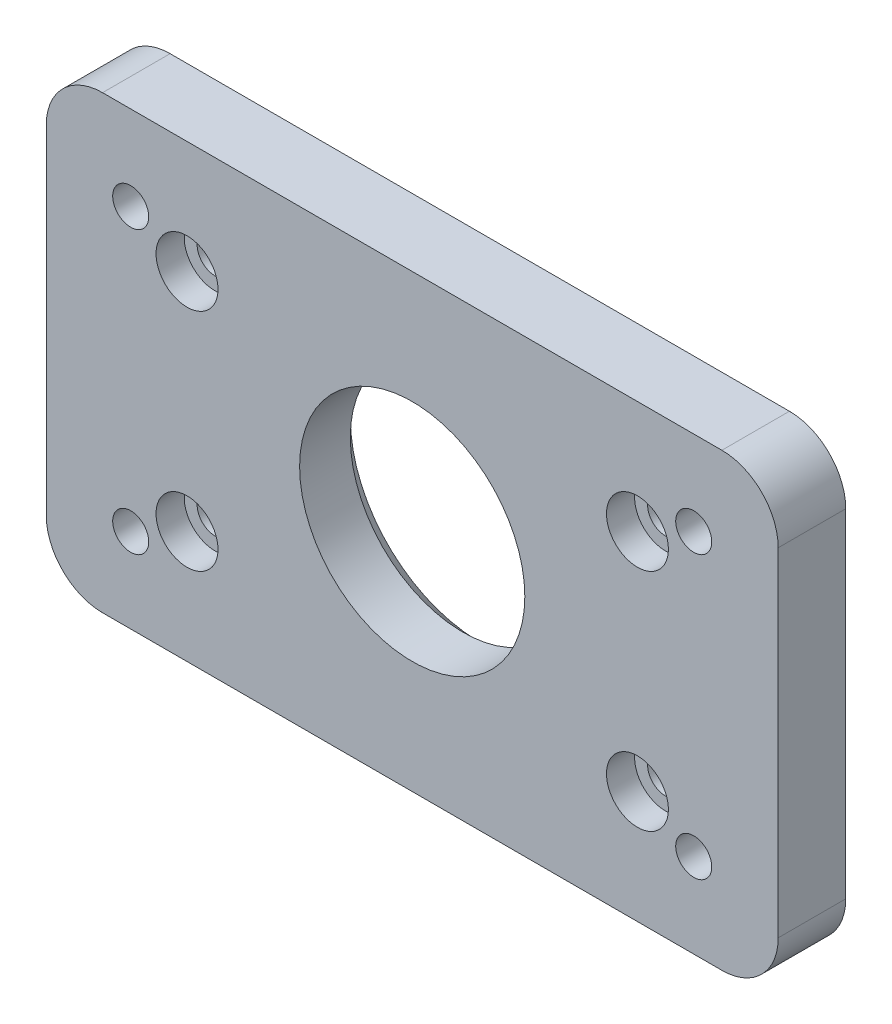
ISO-10303-21;
HEADER;
FILE_DESCRIPTION(('STEP AP214'),'2;1');
FILE_NAME('part.step','',(''),(''),'','','');
FILE_SCHEMA(('AUTOMOTIVE_DESIGN { 1 0 10303 214 1 1 1 1 }'));
ENDSEC;
DATA;
#1=APPLICATION_CONTEXT('core data for automotive mechanical design processes');
#2=APPLICATION_PROTOCOL_DEFINITION('international standard','automotive_design',2000,#1);
#3=PRODUCT_CONTEXT('',#1,'mechanical');
#4=PRODUCT('Part','Part','',(#3));
#5=PRODUCT_RELATED_PRODUCT_CATEGORY('part','',(#4));
#6=PRODUCT_DEFINITION_FORMATION('','',#4);
#7=PRODUCT_DEFINITION_CONTEXT('part definition',#1,'design');
#8=PRODUCT_DEFINITION('design','',#6,#7);
#9=PRODUCT_DEFINITION_SHAPE('','',#8);
#10=(LENGTH_UNIT() NAMED_UNIT(*) SI_UNIT(.MILLI.,.METRE.));
#11=(NAMED_UNIT(*) PLANE_ANGLE_UNIT() SI_UNIT($,.RADIAN.));
#12=(NAMED_UNIT(*) SI_UNIT($,.STERADIAN.) SOLID_ANGLE_UNIT());
#13=UNCERTAINTY_MEASURE_WITH_UNIT(LENGTH_MEASURE(1.E-05),#10,'distance_accuracy_value','');
#14=(GEOMETRIC_REPRESENTATION_CONTEXT(3) GLOBAL_UNCERTAINTY_ASSIGNED_CONTEXT((#13)) GLOBAL_UNIT_ASSIGNED_CONTEXT((#10,
#11,#12)) REPRESENTATION_CONTEXT('',''));
#15=CARTESIAN_POINT('',(0.,0.,0.));
#16=DIRECTION('',(0.,0.,1.));
#17=DIRECTION('',(1.,0.,0.));
#18=AXIS2_PLACEMENT_3D('',#15,#16,#17);
#19=CARTESIAN_POINT('',(40.,-20.,12.));
#20=DIRECTION('',(0.,0.,-1.));
#21=DIRECTION('',(-1.,0.,0.));
#22=AXIS2_PLACEMENT_3D('',#19,#20,#21);
#23=CYLINDRICAL_SURFACE('',#22,3.2);
#24=CARTESIAN_POINT('',(40.,-20.,0.));
#25=DIRECTION('',(0.,0.,1.));
#26=DIRECTION('',(1.,0.,0.));
#27=AXIS2_PLACEMENT_3D('',#24,#25,#26);
#28=CIRCLE('',#27,3.2);
#29=CARTESIAN_POINT('',(43.2,-20.,0.));
#30=VERTEX_POINT('',#29);
#31=EDGE_CURVE('E215',#30,#30,#28,.T.);
#32=ORIENTED_EDGE('',*,*,#31,.F.);
#33=EDGE_LOOP('',(#32));
#34=FACE_BOUND('',#33,.T.);
#35=CARTESIAN_POINT('',(40.,-20.,7.));
#36=DIRECTION('',(0.,0.,1.));
#37=DIRECTION('',(1.,0.,0.));
#38=AXIS2_PLACEMENT_3D('',#35,#36,#37);
#39=CIRCLE('',#38,3.2);
#40=CARTESIAN_POINT('',(43.2,-20.,7.));
#41=VERTEX_POINT('',#40);
#42=EDGE_CURVE('E51',#41,#41,#39,.T.);
#43=ORIENTED_EDGE('',*,*,#42,.T.);
#44=EDGE_LOOP('',(#43));
#45=FACE_BOUND('',#44,.T.);
#46=ADVANCED_FACE('F46',(#34,#45),#23,.F.);
#47=CARTESIAN_POINT('',(-40.,20.,12.));
#48=DIRECTION('',(0.,0.,-1.));
#49=DIRECTION('',(-1.,0.,0.));
#50=AXIS2_PLACEMENT_3D('',#47,#48,#49);
#51=CYLINDRICAL_SURFACE('',#50,3.2);
#52=CARTESIAN_POINT('',(-40.,20.,0.));
#53=DIRECTION('',(0.,0.,1.));
#54=DIRECTION('',(1.,0.,0.));
#55=AXIS2_PLACEMENT_3D('',#52,#53,#54);
#56=CIRCLE('',#55,3.2);
#57=CARTESIAN_POINT('',(-36.8,20.,0.));
#58=VERTEX_POINT('',#57);
#59=EDGE_CURVE('E190',#58,#58,#56,.T.);
#60=ORIENTED_EDGE('',*,*,#59,.F.);
#61=EDGE_LOOP('',(#60));
#62=FACE_BOUND('',#61,.T.);
#63=CARTESIAN_POINT('',(-40.,20.,7.));
#64=DIRECTION('',(0.,0.,1.));
#65=DIRECTION('',(1.,0.,0.));
#66=AXIS2_PLACEMENT_3D('',#63,#64,#65);
#67=CIRCLE('',#66,3.2);
#68=CARTESIAN_POINT('',(-36.8,20.,7.));
#69=VERTEX_POINT('',#68);
#70=EDGE_CURVE('E181',#69,#69,#67,.T.);
#71=ORIENTED_EDGE('',*,*,#70,.T.);
#72=EDGE_LOOP('',(#71));
#73=FACE_BOUND('',#72,.T.);
#74=ADVANCED_FACE('F283',(#62,#73),#51,.F.);
#75=CARTESIAN_POINT('',(-40.,-20.,12.));
#76=DIRECTION('',(0.,0.,-1.));
#77=DIRECTION('',(-1.,0.,0.));
#78=AXIS2_PLACEMENT_3D('',#75,#76,#77);
#79=CYLINDRICAL_SURFACE('',#78,3.2);
#80=CARTESIAN_POINT('',(-40.,-20.,0.));
#81=DIRECTION('',(0.,0.,1.));
#82=DIRECTION('',(1.,0.,0.));
#83=AXIS2_PLACEMENT_3D('',#80,#81,#82);
#84=CIRCLE('',#83,3.2);
#85=CARTESIAN_POINT('',(-36.8,-20.,0.));
#86=VERTEX_POINT('',#85);
#87=EDGE_CURVE('E186',#86,#86,#84,.F.);
#88=ORIENTED_EDGE('',*,*,#87,.T.);
#89=EDGE_LOOP('',(#88));
#90=FACE_BOUND('',#89,.T.);
#91=CARTESIAN_POINT('',(-40.,-20.,7.));
#92=DIRECTION('',(0.,0.,1.));
#93=DIRECTION('',(1.,0.,0.));
#94=AXIS2_PLACEMENT_3D('',#91,#92,#93);
#95=CIRCLE('',#94,3.2);
#96=CARTESIAN_POINT('',(-36.8,-20.,7.));
#97=VERTEX_POINT('',#96);
#98=EDGE_CURVE('E178',#97,#97,#95,.F.);
#99=ORIENTED_EDGE('',*,*,#98,.F.);
#100=EDGE_LOOP('',(#99));
#101=FACE_BOUND('',#100,.T.);
#102=ADVANCED_FACE('F290',(#90,#101),#79,.F.);
#103=CARTESIAN_POINT('',(40.,20.,12.));
#104=DIRECTION('',(0.,0.,-1.));
#105=DIRECTION('',(-1.,0.,0.));
#106=AXIS2_PLACEMENT_3D('',#103,#104,#105);
#107=CYLINDRICAL_SURFACE('',#106,3.2);
#108=CARTESIAN_POINT('',(40.,20.,0.));
#109=DIRECTION('',(0.,0.,1.));
#110=DIRECTION('',(1.,0.,0.));
#111=AXIS2_PLACEMENT_3D('',#108,#109,#110);
#112=CIRCLE('',#111,3.2);
#113=CARTESIAN_POINT('',(43.2,20.,0.));
#114=VERTEX_POINT('',#113);
#115=EDGE_CURVE('E146',#114,#114,#112,.F.);
#116=ORIENTED_EDGE('',*,*,#115,.T.);
#117=EDGE_LOOP('',(#116));
#118=FACE_BOUND('',#117,.T.);
#119=CARTESIAN_POINT('',(40.,20.,7.));
#120=DIRECTION('',(0.,0.,1.));
#121=DIRECTION('',(1.,0.,0.));
#122=AXIS2_PLACEMENT_3D('',#119,#120,#121);
#123=CIRCLE('',#122,3.2);
#124=CARTESIAN_POINT('',(43.2,20.,7.));
#125=VERTEX_POINT('',#124);
#126=EDGE_CURVE('E175',#125,#125,#123,.F.);
#127=ORIENTED_EDGE('',*,*,#126,.F.);
#128=EDGE_LOOP('',(#127));
#129=FACE_BOUND('',#128,.T.);
#130=ADVANCED_FACE('F295',(#118,#129),#107,.F.);
#131=CARTESIAN_POINT('',(0.,-39.9999999999998,12.));
#132=DIRECTION('',(0.,-1.,0.));
#133=DIRECTION('',(0.,0.,-1.));
#134=AXIS2_PLACEMENT_3D('',#131,#132,#133);
#135=PLANE('',#134);
#136=DIRECTION('',(-1.,0.,0.));
#137=VECTOR('',#136,1.);
#138=CARTESIAN_POINT('',(0.,-39.9999999999998,0.));
#139=LINE('',#138,#137);
#140=CARTESIAN_POINT('',(55.,-39.9999999999998,0.));
#141=VERTEX_POINT('',#140);
#142=CARTESIAN_POINT('',(-55.,-39.9999999999998,0.));
#143=VERTEX_POINT('',#142);
#144=EDGE_CURVE('E207',#141,#143,#139,.T.);
#145=ORIENTED_EDGE('',*,*,#144,.F.);
#146=DIRECTION('',(0.,0.,-1.));
#147=VECTOR('',#146,1.);
#148=CARTESIAN_POINT('',(55.,-39.9999999999998,12.));
#149=LINE('',#148,#147);
#150=CARTESIAN_POINT('',(55.,-39.9999999999998,12.));
#151=VERTEX_POINT('',#150);
#152=EDGE_CURVE('E168',#141,#151,#149,.F.);
#153=ORIENTED_EDGE('',*,*,#152,.T.);
#154=DIRECTION('',(-1.,0.,0.));
#155=VECTOR('',#154,1.);
#156=CARTESIAN_POINT('',(0.,-39.9999999999998,12.));
#157=LINE('',#156,#155);
#158=CARTESIAN_POINT('',(-55.,-39.9999999999998,12.));
#159=VERTEX_POINT('',#158);
#160=EDGE_CURVE('E240',#151,#159,#157,.T.);
#161=ORIENTED_EDGE('',*,*,#160,.T.);
#162=DIRECTION('',(0.,0.,-1.));
#163=VECTOR('',#162,1.);
#164=CARTESIAN_POINT('',(-55.,-39.9999999999998,12.));
#165=LINE('',#164,#163);
#166=EDGE_CURVE('E165',#159,#143,#165,.T.);
#167=ORIENTED_EDGE('',*,*,#166,.T.);
#168=EDGE_LOOP('',(#145,#153,#161,#167));
#169=FACE_BOUND('',#168,.T.);
#170=ADVANCED_FACE('F258',(#169),#135,.T.);
#171=CARTESIAN_POINT('',(65.,0.,12.));
#172=DIRECTION('',(1.,0.,0.));
#173=DIRECTION('',(0.,0.,-1.));
#174=AXIS2_PLACEMENT_3D('',#171,#172,#173);
#175=PLANE('',#174);
#176=DIRECTION('',(0.,-1.,0.));
#177=VECTOR('',#176,1.);
#178=CARTESIAN_POINT('',(65.,0.,0.));
#179=LINE('',#178,#177);
#180=CARTESIAN_POINT('',(65.,30.,0.));
#181=VERTEX_POINT('',#180);
#182=CARTESIAN_POINT('',(65.,-29.9999999999997,0.));
#183=VERTEX_POINT('',#182);
#184=EDGE_CURVE('E136',#181,#183,#179,.T.);
#185=ORIENTED_EDGE('',*,*,#184,.F.);
#186=DIRECTION('',(0.,0.,-1.));
#187=VECTOR('',#186,1.);
#188=CARTESIAN_POINT('',(65.,30.,12.));
#189=LINE('',#188,#187);
#190=CARTESIAN_POINT('',(65.,30.,12.));
#191=VERTEX_POINT('',#190);
#192=EDGE_CURVE('E156',#181,#191,#189,.F.);
#193=ORIENTED_EDGE('',*,*,#192,.T.);
#194=DIRECTION('',(0.,-1.,0.));
#195=VECTOR('',#194,1.);
#196=CARTESIAN_POINT('',(65.,0.,12.));
#197=LINE('',#196,#195);
#198=CARTESIAN_POINT('',(65.,-29.9999999999997,12.));
#199=VERTEX_POINT('',#198);
#200=EDGE_CURVE('E243',#191,#199,#197,.T.);
#201=ORIENTED_EDGE('',*,*,#200,.T.);
#202=DIRECTION('',(0.,0.,-1.));
#203=VECTOR('',#202,1.);
#204=CARTESIAN_POINT('',(65.,-29.9999999999997,12.));
#205=LINE('',#204,#203);
#206=EDGE_CURVE('E153',#199,#183,#205,.T.);
#207=ORIENTED_EDGE('',*,*,#206,.T.);
#208=EDGE_LOOP('',(#185,#193,#201,#207));
#209=FACE_BOUND('',#208,.T.);
#210=ADVANCED_FACE('F266',(#209),#175,.T.);
#211=CARTESIAN_POINT('',(0.,40.,12.));
#212=DIRECTION('',(0.,1.,0.));
#213=DIRECTION('',(0.,0.,1.));
#214=AXIS2_PLACEMENT_3D('',#211,#212,#213);
#215=PLANE('',#214);
#216=DIRECTION('',(1.,0.,0.));
#217=VECTOR('',#216,1.);
#218=CARTESIAN_POINT('',(0.,40.,12.));
#219=LINE('',#218,#217);
#220=CARTESIAN_POINT('',(-55.,40.,12.));
#221=VERTEX_POINT('',#220);
#222=CARTESIAN_POINT('',(55.,40.,12.));
#223=VERTEX_POINT('',#222);
#224=EDGE_CURVE('E246',#221,#223,#219,.T.);
#225=ORIENTED_EDGE('',*,*,#224,.T.);
#226=DIRECTION('',(0.,0.,-1.));
#227=VECTOR('',#226,1.);
#228=CARTESIAN_POINT('',(55.,40.,12.));
#229=LINE('',#228,#227);
#230=CARTESIAN_POINT('',(55.,40.,0.));
#231=VERTEX_POINT('',#230);
#232=EDGE_CURVE('E135',#223,#231,#229,.T.);
#233=ORIENTED_EDGE('',*,*,#232,.T.);
#234=DIRECTION('',(1.,0.,0.));
#235=VECTOR('',#234,1.);
#236=CARTESIAN_POINT('',(0.,40.,0.));
#237=LINE('',#236,#235);
#238=CARTESIAN_POINT('',(-55.,40.,0.));
#239=VERTEX_POINT('',#238);
#240=EDGE_CURVE('E120',#239,#231,#237,.T.);
#241=ORIENTED_EDGE('',*,*,#240,.F.);
#242=DIRECTION('',(0.,0.,-1.));
#243=VECTOR('',#242,1.);
#244=CARTESIAN_POINT('',(-55.,40.,12.));
#245=LINE('',#244,#243);
#246=EDGE_CURVE('E133',#239,#221,#245,.F.);
#247=ORIENTED_EDGE('',*,*,#246,.T.);
#248=EDGE_LOOP('',(#225,#233,#241,#247));
#249=FACE_BOUND('',#248,.T.);
#250=ADVANCED_FACE('F132',(#249),#215,.T.);
#251=CARTESIAN_POINT('',(50.,-25.,12.));
#252=DIRECTION('',(0.,0.,-1.));
#253=DIRECTION('',(-1.,0.,0.));
#254=AXIS2_PLACEMENT_3D('',#251,#252,#253);
#255=CYLINDRICAL_SURFACE('',#254,3.2);
#256=CARTESIAN_POINT('',(50.,-25.,12.));
#257=DIRECTION('',(0.,0.,1.));
#258=DIRECTION('',(1.,0.,0.));
#259=AXIS2_PLACEMENT_3D('',#256,#257,#258);
#260=CIRCLE('',#259,3.2);
#261=CARTESIAN_POINT('',(53.2,-25.,12.));
#262=VERTEX_POINT('',#261);
#263=EDGE_CURVE('E139',#262,#262,#260,.F.);
#264=ORIENTED_EDGE('',*,*,#263,.F.);
#265=EDGE_LOOP('',(#264));
#266=FACE_BOUND('',#265,.T.);
#267=CARTESIAN_POINT('',(50.,-25.,0.));
#268=DIRECTION('',(0.,0.,1.));
#269=DIRECTION('',(1.,0.,0.));
#270=AXIS2_PLACEMENT_3D('',#267,#268,#269);
#271=CIRCLE('',#270,3.2);
#272=CARTESIAN_POINT('',(53.2,-25.,0.));
#273=VERTEX_POINT('',#272);
#274=EDGE_CURVE('E213',#273,#273,#271,.F.);
#275=ORIENTED_EDGE('',*,*,#274,.T.);
#276=EDGE_LOOP('',(#275));
#277=FACE_BOUND('',#276,.T.);
#278=ADVANCED_FACE('F296',(#266,#277),#255,.F.);
#279=CARTESIAN_POINT('',(-65.,0.,12.));
#280=DIRECTION('',(-1.,0.,0.));
#281=DIRECTION('',(0.,0.,1.));
#282=AXIS2_PLACEMENT_3D('',#279,#280,#281);
#283=PLANE('',#282);
#284=DIRECTION('',(0.,1.,0.));
#285=VECTOR('',#284,1.);
#286=CARTESIAN_POINT('',(-65.,0.,12.));
#287=LINE('',#286,#285);
#288=CARTESIAN_POINT('',(-65.,-29.9999999999997,12.));
#289=VERTEX_POINT('',#288);
#290=CARTESIAN_POINT('',(-65.,30.,12.));
#291=VERTEX_POINT('',#290);
#292=EDGE_CURVE('E143',#289,#291,#287,.T.);
#293=ORIENTED_EDGE('',*,*,#292,.T.);
#294=DIRECTION('',(0.,0.,-1.));
#295=VECTOR('',#294,1.);
#296=CARTESIAN_POINT('',(-65.,30.,12.));
#297=LINE('',#296,#295);
#298=CARTESIAN_POINT('',(-65.,30.,0.));
#299=VERTEX_POINT('',#298);
#300=EDGE_CURVE('E171',#291,#299,#297,.T.);
#301=ORIENTED_EDGE('',*,*,#300,.T.);
#302=DIRECTION('',(0.,1.,0.));
#303=VECTOR('',#302,1.);
#304=CARTESIAN_POINT('',(-65.,0.,0.));
#305=LINE('',#304,#303);
#306=CARTESIAN_POINT('',(-65.,-29.9999999999997,0.));
#307=VERTEX_POINT('',#306);
#308=EDGE_CURVE('E121',#307,#299,#305,.T.);
#309=ORIENTED_EDGE('',*,*,#308,.F.);
#310=DIRECTION('',(0.,0.,-1.));
#311=VECTOR('',#310,1.);
#312=CARTESIAN_POINT('',(-65.,-29.9999999999997,12.));
#313=LINE('',#312,#311);
#314=EDGE_CURVE('E71',#307,#289,#313,.F.);
#315=ORIENTED_EDGE('',*,*,#314,.T.);
#316=EDGE_LOOP('',(#293,#301,#309,#315));
#317=FACE_BOUND('',#316,.T.);
#318=ADVANCED_FACE('F247',(#317),#283,.T.);
#319=CARTESIAN_POINT('',(50.,25.,12.));
#320=DIRECTION('',(0.,0.,-1.));
#321=DIRECTION('',(-1.,0.,0.));
#322=AXIS2_PLACEMENT_3D('',#319,#320,#321);
#323=CYLINDRICAL_SURFACE('',#322,3.2);
#324=CARTESIAN_POINT('',(50.,25.,12.));
#325=DIRECTION('',(0.,0.,1.));
#326=DIRECTION('',(1.,0.,0.));
#327=AXIS2_PLACEMENT_3D('',#324,#325,#326);
#328=CIRCLE('',#327,3.2);
#329=CARTESIAN_POINT('',(53.2,25.,12.));
#330=VERTEX_POINT('',#329);
#331=EDGE_CURVE('E237',#330,#330,#328,.T.);
#332=ORIENTED_EDGE('',*,*,#331,.T.);
#333=EDGE_LOOP('',(#332));
#334=FACE_BOUND('',#333,.T.);
#335=CARTESIAN_POINT('',(50.,25.,0.));
#336=DIRECTION('',(0.,0.,1.));
#337=DIRECTION('',(1.,0.,0.));
#338=AXIS2_PLACEMENT_3D('',#335,#336,#337);
#339=CIRCLE('',#338,3.2);
#340=CARTESIAN_POINT('',(53.2,25.,0.));
#341=VERTEX_POINT('',#340);
#342=EDGE_CURVE('E204',#341,#341,#339,.T.);
#343=ORIENTED_EDGE('',*,*,#342,.F.);
#344=EDGE_LOOP('',(#343));
#345=FACE_BOUND('',#344,.T.);
#346=ADVANCED_FACE('F301',(#334,#345),#323,.F.);
#347=CARTESIAN_POINT('',(-50.,25.,12.));
#348=DIRECTION('',(0.,0.,-1.));
#349=DIRECTION('',(-1.,0.,0.));
#350=AXIS2_PLACEMENT_3D('',#347,#348,#349);
#351=CYLINDRICAL_SURFACE('',#350,3.2);
#352=CARTESIAN_POINT('',(-50.,25.,12.));
#353=DIRECTION('',(0.,0.,1.));
#354=DIRECTION('',(1.,0.,0.));
#355=AXIS2_PLACEMENT_3D('',#352,#353,#354);
#356=CIRCLE('',#355,3.2);
#357=CARTESIAN_POINT('',(-46.8,25.,12.));
#358=VERTEX_POINT('',#357);
#359=EDGE_CURVE('E229',#358,#358,#356,.F.);
#360=ORIENTED_EDGE('',*,*,#359,.F.);
#361=EDGE_LOOP('',(#360));
#362=FACE_BOUND('',#361,.T.);
#363=CARTESIAN_POINT('',(-50.,25.,0.));
#364=DIRECTION('',(0.,0.,1.));
#365=DIRECTION('',(1.,0.,0.));
#366=AXIS2_PLACEMENT_3D('',#363,#364,#365);
#367=CIRCLE('',#366,3.2);
#368=CARTESIAN_POINT('',(-46.8,25.,0.));
#369=VERTEX_POINT('',#368);
#370=EDGE_CURVE('E201',#369,#369,#367,.F.);
#371=ORIENTED_EDGE('',*,*,#370,.T.);
#372=EDGE_LOOP('',(#371));
#373=FACE_BOUND('',#372,.T.);
#374=ADVANCED_FACE('F310',(#362,#373),#351,.F.);
#375=CARTESIAN_POINT('',(-50.,-25.,12.));
#376=DIRECTION('',(0.,0.,-1.));
#377=DIRECTION('',(-1.,0.,0.));
#378=AXIS2_PLACEMENT_3D('',#375,#376,#377);
#379=CYLINDRICAL_SURFACE('',#378,3.2);
#380=CARTESIAN_POINT('',(-50.,-25.,12.));
#381=DIRECTION('',(0.,0.,1.));
#382=DIRECTION('',(1.,0.,0.));
#383=AXIS2_PLACEMENT_3D('',#380,#381,#382);
#384=CIRCLE('',#383,3.2);
#385=CARTESIAN_POINT('',(-46.8,-25.,12.));
#386=VERTEX_POINT('',#385);
#387=EDGE_CURVE('E224',#386,#386,#384,.T.);
#388=ORIENTED_EDGE('',*,*,#387,.T.);
#389=EDGE_LOOP('',(#388));
#390=FACE_BOUND('',#389,.T.);
#391=CARTESIAN_POINT('',(-50.,-25.,0.));
#392=DIRECTION('',(0.,0.,1.));
#393=DIRECTION('',(1.,0.,0.));
#394=AXIS2_PLACEMENT_3D('',#391,#392,#393);
#395=CIRCLE('',#394,3.2);
#396=CARTESIAN_POINT('',(-46.8,-25.,0.));
#397=VERTEX_POINT('',#396);
#398=EDGE_CURVE('E195',#397,#397,#395,.T.);
#399=ORIENTED_EDGE('',*,*,#398,.F.);
#400=EDGE_LOOP('',(#399));
#401=FACE_BOUND('',#400,.T.);
#402=ADVANCED_FACE('F314',(#390,#401),#379,.F.);
#403=CARTESIAN_POINT('',(0.,0.,12.));
#404=DIRECTION('',(0.,0.,-1.));
#405=DIRECTION('',(-1.,0.,0.));
#406=AXIS2_PLACEMENT_3D('',#403,#404,#405);
#407=CYLINDRICAL_SURFACE('',#406,20.);
#408=CARTESIAN_POINT('',(0.,0.,3.00000000000001));
#409=DIRECTION('',(0.,0.,1.));
#410=DIRECTION('',(1.,0.,0.));
#411=AXIS2_PLACEMENT_3D('',#408,#409,#410);
#412=CIRCLE('',#411,20.);
#413=CARTESIAN_POINT('',(-20.,0.,3.00000000000001));
#414=VERTEX_POINT('',#413);
#415=EDGE_CURVE('E11',#414,#414,#412,.F.);
#416=ORIENTED_EDGE('',*,*,#415,.T.);
#417=EDGE_LOOP('',(#416));
#418=FACE_BOUND('',#417,.T.);
#419=CARTESIAN_POINT('',(0.,0.,12.));
#420=DIRECTION('',(0.,0.,1.));
#421=DIRECTION('',(1.,0.,0.));
#422=AXIS2_PLACEMENT_3D('',#419,#420,#421);
#423=CIRCLE('',#422,20.);
#424=CARTESIAN_POINT('',(20.,0.,12.));
#425=VERTEX_POINT('',#424);
#426=EDGE_CURVE('E220',#425,#425,#423,.T.);
#427=ORIENTED_EDGE('',*,*,#426,.T.);
#428=EDGE_LOOP('',(#427));
#429=FACE_BOUND('',#428,.T.);
#430=ADVANCED_FACE('F318',(#418,#429),#407,.F.);
#431=CARTESIAN_POINT('',(0.,0.,12.));
#432=DIRECTION('',(0.,0.,1.));
#433=DIRECTION('',(1.,0.,0.));
#434=AXIS2_PLACEMENT_3D('',#431,#432,#433);
#435=PLANE('',#434);
#436=CARTESIAN_POINT('',(-40.,-20.,12.));
#437=DIRECTION('',(0.,0.,1.));
#438=DIRECTION('',(1.,0.,0.));
#439=AXIS2_PLACEMENT_3D('',#436,#437,#438);
#440=CIRCLE('',#439,5.5);
#441=CARTESIAN_POINT('',(-34.5,-20.,12.));
#442=VERTEX_POINT('',#441);
#443=EDGE_CURVE('E367',#442,#442,#440,.T.);
#444=ORIENTED_EDGE('',*,*,#443,.F.);
#445=EDGE_LOOP('',(#444));
#446=FACE_BOUND('',#445,.T.);
#447=CARTESIAN_POINT('',(40.,20.,12.));
#448=DIRECTION('',(0.,0.,1.));
#449=DIRECTION('',(1.,0.,0.));
#450=AXIS2_PLACEMENT_3D('',#447,#448,#449);
#451=CIRCLE('',#450,5.5);
#452=CARTESIAN_POINT('',(45.5,20.,12.));
#453=VERTEX_POINT('',#452);
#454=EDGE_CURVE('E371',#453,#453,#451,.T.);
#455=ORIENTED_EDGE('',*,*,#454,.F.);
#456=EDGE_LOOP('',(#455));
#457=FACE_BOUND('',#456,.T.);
#458=CARTESIAN_POINT('',(40.,-20.,12.));
#459=DIRECTION('',(0.,0.,1.));
#460=DIRECTION('',(1.,0.,0.));
#461=AXIS2_PLACEMENT_3D('',#458,#459,#460);
#462=CIRCLE('',#461,5.5);
#463=CARTESIAN_POINT('',(45.5,-20.,12.));
#464=VERTEX_POINT('',#463);
#465=EDGE_CURVE('E375',#464,#464,#462,.T.);
#466=ORIENTED_EDGE('',*,*,#465,.F.);
#467=EDGE_LOOP('',(#466));
#468=FACE_BOUND('',#467,.T.);
#469=CARTESIAN_POINT('',(-40.,20.,12.));
#470=DIRECTION('',(0.,0.,1.));
#471=DIRECTION('',(1.,0.,0.));
#472=AXIS2_PLACEMENT_3D('',#469,#470,#471);
#473=CIRCLE('',#472,5.5);
#474=CARTESIAN_POINT('',(-34.5,20.,12.));
#475=VERTEX_POINT('',#474);
#476=EDGE_CURVE('E232',#475,#475,#473,.T.);
#477=ORIENTED_EDGE('',*,*,#476,.F.);
#478=EDGE_LOOP('',(#477));
#479=FACE_BOUND('',#478,.T.);
#480=ORIENTED_EDGE('',*,*,#426,.F.);
#481=EDGE_LOOP('',(#480));
#482=FACE_BOUND('',#481,.T.);
#483=ORIENTED_EDGE('',*,*,#387,.F.);
#484=EDGE_LOOP('',(#483));
#485=FACE_BOUND('',#484,.T.);
#486=ORIENTED_EDGE('',*,*,#359,.T.);
#487=EDGE_LOOP('',(#486));
#488=FACE_BOUND('',#487,.T.);
#489=ORIENTED_EDGE('',*,*,#331,.F.);
#490=EDGE_LOOP('',(#489));
#491=FACE_BOUND('',#490,.T.);
#492=ORIENTED_EDGE('',*,*,#200,.F.);
#493=CARTESIAN_POINT('',(55.,30.,12.));
#494=DIRECTION('',(0.,0.,1.));
#495=DIRECTION('',(1.,0.,0.));
#496=AXIS2_PLACEMENT_3D('',#493,#494,#495);
#497=CIRCLE('',#496,10.);
#498=EDGE_CURVE('E163',#191,#223,#497,.T.);
#499=ORIENTED_EDGE('',*,*,#498,.T.);
#500=ORIENTED_EDGE('',*,*,#224,.F.);
#501=CARTESIAN_POINT('',(-55.,30.,12.));
#502=DIRECTION('',(0.,0.,1.));
#503=DIRECTION('',(1.,0.,0.));
#504=AXIS2_PLACEMENT_3D('',#501,#502,#503);
#505=CIRCLE('',#504,10.);
#506=EDGE_CURVE('E64',#221,#291,#505,.T.);
#507=ORIENTED_EDGE('',*,*,#506,.T.);
#508=ORIENTED_EDGE('',*,*,#292,.F.);
#509=CARTESIAN_POINT('',(-55.,-29.9999999999997,12.));
#510=DIRECTION('',(0.,0.,1.));
#511=DIRECTION('',(1.,0.,0.));
#512=AXIS2_PLACEMENT_3D('',#509,#510,#511);
#513=CIRCLE('',#512,10.);
#514=EDGE_CURVE('E158',#289,#159,#513,.T.);
#515=ORIENTED_EDGE('',*,*,#514,.T.);
#516=ORIENTED_EDGE('',*,*,#160,.F.);
#517=CARTESIAN_POINT('',(55.,-29.9999999999997,12.));
#518=DIRECTION('',(0.,0.,1.));
#519=DIRECTION('',(1.,0.,0.));
#520=AXIS2_PLACEMENT_3D('',#517,#518,#519);
#521=CIRCLE('',#520,10.);
#522=EDGE_CURVE('E161',#151,#199,#521,.T.);
#523=ORIENTED_EDGE('',*,*,#522,.T.);
#524=EDGE_LOOP('',(#492,#499,#500,#507,#508,#515,#516,#523));
#525=FACE_BOUND('',#524,.T.);
#526=ORIENTED_EDGE('',*,*,#263,.T.);
#527=EDGE_LOOP('',(#526));
#528=FACE_BOUND('',#527,.T.);
#529=ADVANCED_FACE('F250',(#446,#457,#468,#479,#482,#485,#488,#491,#525,#528),#435,.T.);
#530=CARTESIAN_POINT('',(0.,0.,0.));
#531=DIRECTION('',(0.,0.,1.));
#532=DIRECTION('',(1.,0.,0.));
#533=AXIS2_PLACEMENT_3D('',#530,#531,#532);
#534=PLANE('',#533);
#535=CARTESIAN_POINT('',(0.,0.,0.));
#536=DIRECTION('',(0.,0.,1.));
#537=DIRECTION('',(1.,0.,0.));
#538=AXIS2_PLACEMENT_3D('',#535,#536,#537);
#539=CIRCLE('',#538,23.);
#540=CARTESIAN_POINT('',(-23.,0.,0.));
#541=VERTEX_POINT('',#540);
#542=EDGE_CURVE('E56',#541,#541,#539,.T.);
#543=ORIENTED_EDGE('',*,*,#542,.T.);
#544=EDGE_LOOP('',(#543));
#545=FACE_BOUND('',#544,.T.);
#546=ORIENTED_EDGE('',*,*,#87,.F.);
#547=EDGE_LOOP('',(#546));
#548=FACE_BOUND('',#547,.T.);
#549=ORIENTED_EDGE('',*,*,#59,.T.);
#550=EDGE_LOOP('',(#549));
#551=FACE_BOUND('',#550,.T.);
#552=ORIENTED_EDGE('',*,*,#398,.T.);
#553=EDGE_LOOP('',(#552));
#554=FACE_BOUND('',#553,.T.);
#555=ORIENTED_EDGE('',*,*,#370,.F.);
#556=EDGE_LOOP('',(#555));
#557=FACE_BOUND('',#556,.T.);
#558=ORIENTED_EDGE('',*,*,#342,.T.);
#559=EDGE_LOOP('',(#558));
#560=FACE_BOUND('',#559,.T.);
#561=ORIENTED_EDGE('',*,*,#240,.T.);
#562=CARTESIAN_POINT('',(55.,30.,0.));
#563=DIRECTION('',(0.,0.,1.));
#564=DIRECTION('',(1.,0.,0.));
#565=AXIS2_PLACEMENT_3D('',#562,#563,#564);
#566=CIRCLE('',#565,10.);
#567=EDGE_CURVE('E151',#231,#181,#566,.F.);
#568=ORIENTED_EDGE('',*,*,#567,.T.);
#569=ORIENTED_EDGE('',*,*,#184,.T.);
#570=CARTESIAN_POINT('',(55.,-29.9999999999997,0.));
#571=DIRECTION('',(0.,0.,1.));
#572=DIRECTION('',(1.,0.,0.));
#573=AXIS2_PLACEMENT_3D('',#570,#571,#572);
#574=CIRCLE('',#573,10.);
#575=EDGE_CURVE('E126',#183,#141,#574,.F.);
#576=ORIENTED_EDGE('',*,*,#575,.T.);
#577=ORIENTED_EDGE('',*,*,#144,.T.);
#578=CARTESIAN_POINT('',(-55.,-29.9999999999997,0.));
#579=DIRECTION('',(0.,0.,1.));
#580=DIRECTION('',(1.,0.,0.));
#581=AXIS2_PLACEMENT_3D('',#578,#579,#580);
#582=CIRCLE('',#581,10.);
#583=EDGE_CURVE('E127',#143,#307,#582,.F.);
#584=ORIENTED_EDGE('',*,*,#583,.T.);
#585=ORIENTED_EDGE('',*,*,#308,.T.);
#586=CARTESIAN_POINT('',(-55.,30.,0.));
#587=DIRECTION('',(0.,0.,1.));
#588=DIRECTION('',(1.,0.,0.));
#589=AXIS2_PLACEMENT_3D('',#586,#587,#588);
#590=CIRCLE('',#589,10.);
#591=EDGE_CURVE('E116',#299,#239,#590,.F.);
#592=ORIENTED_EDGE('',*,*,#591,.T.);
#593=EDGE_LOOP('',(#561,#568,#569,#576,#577,#584,#585,#592));
#594=FACE_BOUND('',#593,.T.);
#595=ORIENTED_EDGE('',*,*,#274,.F.);
#596=EDGE_LOOP('',(#595));
#597=FACE_BOUND('',#596,.T.);
#598=ORIENTED_EDGE('',*,*,#31,.T.);
#599=EDGE_LOOP('',(#598));
#600=FACE_BOUND('',#599,.T.);
#601=ORIENTED_EDGE('',*,*,#115,.F.);
#602=EDGE_LOOP('',(#601));
#603=FACE_BOUND('',#602,.T.);
#604=ADVANCED_FACE('F118',(#545,#548,#551,#554,#557,#560,#594,#597,#600,#603),#534,.F.);
#605=CARTESIAN_POINT('',(55.,30.,12.));
#606=DIRECTION('',(0.,0.,-1.));
#607=DIRECTION('',(-1.,0.,0.));
#608=AXIS2_PLACEMENT_3D('',#605,#606,#607);
#609=CYLINDRICAL_SURFACE('',#608,10.);
#610=ORIENTED_EDGE('',*,*,#498,.F.);
#611=ORIENTED_EDGE('',*,*,#192,.F.);
#612=ORIENTED_EDGE('',*,*,#567,.F.);
#613=ORIENTED_EDGE('',*,*,#232,.F.);
#614=EDGE_LOOP('',(#610,#611,#612,#613));
#615=FACE_BOUND('',#614,.T.);
#616=ADVANCED_FACE('F270',(#615),#609,.T.);
#617=CARTESIAN_POINT('',(55.,-29.9999999999997,12.));
#618=DIRECTION('',(0.,0.,-1.));
#619=DIRECTION('',(-1.,0.,0.));
#620=AXIS2_PLACEMENT_3D('',#617,#618,#619);
#621=CYLINDRICAL_SURFACE('',#620,10.);
#622=ORIENTED_EDGE('',*,*,#522,.F.);
#623=ORIENTED_EDGE('',*,*,#152,.F.);
#624=ORIENTED_EDGE('',*,*,#575,.F.);
#625=ORIENTED_EDGE('',*,*,#206,.F.);
#626=EDGE_LOOP('',(#622,#623,#624,#625));
#627=FACE_BOUND('',#626,.T.);
#628=ADVANCED_FACE('F264',(#627),#621,.T.);
#629=CARTESIAN_POINT('',(-55.,30.,12.));
#630=DIRECTION('',(0.,0.,-1.));
#631=DIRECTION('',(-1.,0.,0.));
#632=AXIS2_PLACEMENT_3D('',#629,#630,#631);
#633=CYLINDRICAL_SURFACE('',#632,10.);
#634=ORIENTED_EDGE('',*,*,#506,.F.);
#635=ORIENTED_EDGE('',*,*,#246,.F.);
#636=ORIENTED_EDGE('',*,*,#591,.F.);
#637=ORIENTED_EDGE('',*,*,#300,.F.);
#638=EDGE_LOOP('',(#634,#635,#636,#637));
#639=FACE_BOUND('',#638,.T.);
#640=ADVANCED_FACE('F138',(#639),#633,.T.);
#641=CARTESIAN_POINT('',(-55.,-29.9999999999997,12.));
#642=DIRECTION('',(0.,0.,-1.));
#643=DIRECTION('',(-1.,0.,0.));
#644=AXIS2_PLACEMENT_3D('',#641,#642,#643);
#645=CYLINDRICAL_SURFACE('',#644,10.);
#646=ORIENTED_EDGE('',*,*,#514,.F.);
#647=ORIENTED_EDGE('',*,*,#314,.F.);
#648=ORIENTED_EDGE('',*,*,#583,.F.);
#649=ORIENTED_EDGE('',*,*,#166,.F.);
#650=EDGE_LOOP('',(#646,#647,#648,#649));
#651=FACE_BOUND('',#650,.T.);
#652=ADVANCED_FACE('F255',(#651),#645,.T.);
#653=CARTESIAN_POINT('',(0.,0.,0.));
#654=DIRECTION('',(0.,0.,-1.));
#655=DIRECTION('',(-1.,0.,0.));
#656=AXIS2_PLACEMENT_3D('',#653,#654,#655);
#657=CONICAL_SURFACE('',#656,23.,0.785398163397446);
#658=CARTESIAN_POINT('',(-20.,0.,3.00000000000001));
#659=CARTESIAN_POINT('',(-20.03125,0.,2.96875000000001));
#660=CARTESIAN_POINT('',(-20.0625,0.,2.93750000000001));
#661=CARTESIAN_POINT('',(-20.125,0.,2.87500000000001));
#662=CARTESIAN_POINT('',(-20.15625,0.,2.84375000000001));
#663=CARTESIAN_POINT('',(-20.21875,0.,2.78125000000001));
#664=CARTESIAN_POINT('',(-20.25,0.,2.75));
#665=CARTESIAN_POINT('',(-20.3125,0.,2.6875));
#666=CARTESIAN_POINT('',(-20.34375,0.,2.65625));
#667=CARTESIAN_POINT('',(-20.40625,0.,2.59375));
#668=CARTESIAN_POINT('',(-20.4375,0.,2.56250000000001));
#669=CARTESIAN_POINT('',(-20.5,0.,2.5));
#670=CARTESIAN_POINT('',(-20.53125,0.,2.46875));
#671=CARTESIAN_POINT('',(-20.59375,0.,2.40625));
#672=CARTESIAN_POINT('',(-20.625,0.,2.375));
#673=CARTESIAN_POINT('',(-20.6875,0.,2.3125));
#674=CARTESIAN_POINT('',(-20.71875,0.,2.28125));
#675=CARTESIAN_POINT('',(-20.78125,0.,2.21875));
#676=CARTESIAN_POINT('',(-20.8125,0.,2.1875));
#677=CARTESIAN_POINT('',(-20.875,0.,2.125));
#678=CARTESIAN_POINT('',(-20.90625,0.,2.09375));
#679=CARTESIAN_POINT('',(-20.96875,0.,2.03125));
#680=CARTESIAN_POINT('',(-21.,0.,2.));
#681=CARTESIAN_POINT('',(-21.0625,0.,1.9375));
#682=CARTESIAN_POINT('',(-21.09375,0.,1.90625));
#683=CARTESIAN_POINT('',(-21.15625,0.,1.84375));
#684=CARTESIAN_POINT('',(-21.1875,0.,1.8125));
#685=CARTESIAN_POINT('',(-21.25,0.,1.75));
#686=CARTESIAN_POINT('',(-21.28125,0.,1.71875));
#687=CARTESIAN_POINT('',(-21.34375,0.,1.65625));
#688=CARTESIAN_POINT('',(-21.375,0.,1.625));
#689=CARTESIAN_POINT('',(-21.4375,0.,1.5625));
#690=CARTESIAN_POINT('',(-21.46875,0.,1.53125));
#691=CARTESIAN_POINT('',(-21.53125,0.,1.46875));
#692=CARTESIAN_POINT('',(-21.5625,0.,1.4375));
#693=CARTESIAN_POINT('',(-21.625,0.,1.375));
#694=CARTESIAN_POINT('',(-21.65625,0.,1.34375));
#695=CARTESIAN_POINT('',(-21.71875,0.,1.28125));
#696=CARTESIAN_POINT('',(-21.75,0.,1.25));
#697=CARTESIAN_POINT('',(-21.8125,0.,1.1875));
#698=CARTESIAN_POINT('',(-21.84375,0.,1.15625));
#699=CARTESIAN_POINT('',(-21.90625,0.,1.09375));
#700=CARTESIAN_POINT('',(-21.9375,0.,1.0625));
#701=CARTESIAN_POINT('',(-22.,0.,1.));
#702=CARTESIAN_POINT('',(-22.03125,0.,0.968750000000002));
#703=CARTESIAN_POINT('',(-22.09375,0.,0.906250000000002));
#704=CARTESIAN_POINT('',(-22.125,0.,0.875000000000002));
#705=CARTESIAN_POINT('',(-22.1875,0.,0.812500000000001));
#706=CARTESIAN_POINT('',(-22.21875,0.,0.781250000000001));
#707=CARTESIAN_POINT('',(-22.28125,0.,0.718750000000002));
#708=CARTESIAN_POINT('',(-22.3125,0.,0.687500000000002));
#709=CARTESIAN_POINT('',(-22.375,0.,0.625000000000002));
#710=CARTESIAN_POINT('',(-22.40625,0.,0.593750000000001));
#711=CARTESIAN_POINT('',(-22.46875,0.,0.531250000000001));
#712=CARTESIAN_POINT('',(-22.5,0.,0.500000000000001));
#713=CARTESIAN_POINT('',(-22.5625,0.,0.437500000000001));
#714=CARTESIAN_POINT('',(-22.59375,0.,0.406250000000001));
#715=CARTESIAN_POINT('',(-22.65625,0.,0.343750000000001));
#716=CARTESIAN_POINT('',(-22.6875,0.,0.312500000000001));
#717=CARTESIAN_POINT('',(-22.75,0.,0.25));
#718=CARTESIAN_POINT('',(-22.78125,0.,0.21875));
#719=CARTESIAN_POINT('',(-22.84375,0.,0.15625));
#720=CARTESIAN_POINT('',(-22.875,0.,0.125));
#721=CARTESIAN_POINT('',(-22.9375,0.,0.0625000000000001));
#722=CARTESIAN_POINT('',(-22.96875,0.,0.0312500000000001));
#723=CARTESIAN_POINT('',(-23.,0.,0.));
#724=B_SPLINE_CURVE_WITH_KNOTS('',3,(#658,#659,#660,#661,#662,#663,#664,#665,#666,#667,#668,
#669,#670,#671,#672,#673,#674,#675,#676,#677,#678,#679,#680,#681,#682,#683,#684,#685,#686,#687,
#688,#689,#690,#691,#692,#693,#694,#695,#696,#697,#698,#699,#700,#701,#702,#703,#704,#705,#706,
#707,#708,#709,#710,#711,#712,#713,#714,#715,#716,#717,#718,#719,#720,#721,#722,#723),
.UNSPECIFIED.,.F.,.F.,(4,2,2,2,2,2,2,2,2,2,2,2,2,2,2,2,2,2,2,2,2,2,2,2,2,2,2,2,2,2,2,2,4),(0.,
0.132582521472478,0.265165042944956,0.397747564417434,0.530330085889911,0.662912607362389,
0.795495128834865,0.928077650307343,1.06066017177982,1.1932426932523,1.32582521472478,
1.45840773619725,1.59099025766973,1.72357277914221,1.85615530061469,1.98873782208717,
2.12132034355964,2.25390286503212,2.3864853865046,2.51906790797708,2.65165042944955,
2.78423295092203,2.91681547239451,3.04939799386699,3.18198051533946,3.31456303681194,
3.44714555828442,3.57972807975689,3.71231060122937,3.84489312270185,3.97747564417433,
4.11005816564681,4.24264068711928),.UNSPECIFIED.);
#725=EDGE_CURVE('BSEAM49',#414,#541,#724,.T.);
#726=ORIENTED_EDGE('',*,*,#415,.F.);
#727=ORIENTED_EDGE('',*,*,#542,.F.);
#728=ORIENTED_EDGE('',*,*,#725,.T.);
#729=ORIENTED_EDGE('',*,*,#725,.F.);
#730=EDGE_LOOP('',(#726,#728,#727,#729));
#731=FACE_BOUND('',#730,.T.);
#732=ADVANCED_FACE('F49',(#731),#657,.F.);
#733=CARTESIAN_POINT('',(-40.,20.,7.));
#734=DIRECTION('',(0.,0.,1.));
#735=DIRECTION('',(1.,0.,0.));
#736=AXIS2_PLACEMENT_3D('',#733,#734,#735);
#737=CYLINDRICAL_SURFACE('',#736,5.5);
#738=CARTESIAN_POINT('',(-40.,20.,7.));
#739=DIRECTION('',(0.,0.,1.));
#740=DIRECTION('',(1.,0.,0.));
#741=AXIS2_PLACEMENT_3D('',#738,#739,#740);
#742=CIRCLE('',#741,5.5);
#743=CARTESIAN_POINT('',(-34.5,20.,7.));
#744=VERTEX_POINT('',#743);
#745=EDGE_CURVE('E179',#744,#744,#742,.T.);
#746=ORIENTED_EDGE('',*,*,#745,.F.);
#747=EDGE_LOOP('',(#746));
#748=FACE_BOUND('',#747,.T.);
#749=ORIENTED_EDGE('',*,*,#476,.T.);
#750=EDGE_LOOP('',(#749));
#751=FACE_BOUND('',#750,.T.);
#752=ADVANCED_FACE('F355',(#748,#751),#737,.F.);
#753=CARTESIAN_POINT('',(-40.,20.,7.));
#754=DIRECTION('',(0.,0.,1.));
#755=DIRECTION('',(1.,0.,0.));
#756=AXIS2_PLACEMENT_3D('',#753,#754,#755);
#757=PLANE('',#756);
#758=ORIENTED_EDGE('',*,*,#70,.F.);
#759=EDGE_LOOP('',(#758));
#760=FACE_BOUND('',#759,.T.);
#761=ORIENTED_EDGE('',*,*,#745,.T.);
#762=EDGE_LOOP('',(#761));
#763=FACE_BOUND('',#762,.T.);
#764=ADVANCED_FACE('F351',(#760,#763),#757,.T.);
#765=CARTESIAN_POINT('',(40.,-20.,7.));
#766=DIRECTION('',(0.,0.,1.));
#767=DIRECTION('',(1.,0.,0.));
#768=AXIS2_PLACEMENT_3D('',#765,#766,#767);
#769=CYLINDRICAL_SURFACE('',#768,5.5);
#770=CARTESIAN_POINT('',(40.,-20.,7.));
#771=DIRECTION('',(0.,0.,1.));
#772=DIRECTION('',(1.,0.,0.));
#773=AXIS2_PLACEMENT_3D('',#770,#771,#772);
#774=CIRCLE('',#773,5.5);
#775=CARTESIAN_POINT('',(45.5,-20.,7.));
#776=VERTEX_POINT('',#775);
#777=EDGE_CURVE('E401',#776,#776,#774,.T.);
#778=ORIENTED_EDGE('',*,*,#777,.F.);
#779=EDGE_LOOP('',(#778));
#780=FACE_BOUND('',#779,.T.);
#781=ORIENTED_EDGE('',*,*,#465,.T.);
#782=EDGE_LOOP('',(#781));
#783=FACE_BOUND('',#782,.T.);
#784=ADVANCED_FACE('F354',(#780,#783),#769,.F.);
#785=CARTESIAN_POINT('',(40.,-20.,7.));
#786=DIRECTION('',(0.,0.,1.));
#787=DIRECTION('',(1.,0.,0.));
#788=AXIS2_PLACEMENT_3D('',#785,#786,#787);
#789=PLANE('',#788);
#790=ORIENTED_EDGE('',*,*,#42,.F.);
#791=EDGE_LOOP('',(#790));
#792=FACE_BOUND('',#791,.T.);
#793=ORIENTED_EDGE('',*,*,#777,.T.);
#794=EDGE_LOOP('',(#793));
#795=FACE_BOUND('',#794,.T.);
#796=ADVANCED_FACE('F349',(#792,#795),#789,.T.);
#797=CARTESIAN_POINT('',(40.,20.,7.));
#798=DIRECTION('',(0.,0.,1.));
#799=DIRECTION('',(1.,0.,0.));
#800=AXIS2_PLACEMENT_3D('',#797,#798,#799);
#801=PLANE('',#800);
#802=CARTESIAN_POINT('',(40.,20.,7.));
#803=DIRECTION('',(0.,0.,1.));
#804=DIRECTION('',(1.,0.,0.));
#805=AXIS2_PLACEMENT_3D('',#802,#803,#804);
#806=CIRCLE('',#805,5.5);
#807=CARTESIAN_POINT('',(45.5,20.,7.));
#808=VERTEX_POINT('',#807);
#809=EDGE_CURVE('E405',#808,#808,#806,.T.);
#810=ORIENTED_EDGE('',*,*,#809,.T.);
#811=EDGE_LOOP('',(#810));
#812=FACE_BOUND('',#811,.T.);
#813=ORIENTED_EDGE('',*,*,#126,.T.);
#814=EDGE_LOOP('',(#813));
#815=FACE_BOUND('',#814,.T.);
#816=ADVANCED_FACE('F341',(#812,#815),#801,.T.);
#817=CARTESIAN_POINT('',(40.,20.,7.));
#818=DIRECTION('',(0.,0.,1.));
#819=DIRECTION('',(1.,0.,0.));
#820=AXIS2_PLACEMENT_3D('',#817,#818,#819);
#821=CYLINDRICAL_SURFACE('',#820,5.5);
#822=ORIENTED_EDGE('',*,*,#809,.F.);
#823=EDGE_LOOP('',(#822));
#824=FACE_BOUND('',#823,.T.);
#825=ORIENTED_EDGE('',*,*,#454,.T.);
#826=EDGE_LOOP('',(#825));
#827=FACE_BOUND('',#826,.T.);
#828=ADVANCED_FACE('F332',(#824,#827),#821,.F.);
#829=CARTESIAN_POINT('',(-40.,-20.,7.));
#830=DIRECTION('',(0.,0.,1.));
#831=DIRECTION('',(1.,0.,0.));
#832=AXIS2_PLACEMENT_3D('',#829,#830,#831);
#833=PLANE('',#832);
#834=CARTESIAN_POINT('',(-40.,-20.,7.));
#835=DIRECTION('',(0.,0.,1.));
#836=DIRECTION('',(1.,0.,0.));
#837=AXIS2_PLACEMENT_3D('',#834,#835,#836);
#838=CIRCLE('',#837,5.5);
#839=CARTESIAN_POINT('',(-34.5,-20.,7.));
#840=VERTEX_POINT('',#839);
#841=EDGE_CURVE('E396',#840,#840,#838,.T.);
#842=ORIENTED_EDGE('',*,*,#841,.T.);
#843=EDGE_LOOP('',(#842));
#844=FACE_BOUND('',#843,.T.);
#845=ORIENTED_EDGE('',*,*,#98,.T.);
#846=EDGE_LOOP('',(#845));
#847=FACE_BOUND('',#846,.T.);
#848=ADVANCED_FACE('F329',(#844,#847),#833,.T.);
#849=CARTESIAN_POINT('',(-40.,-20.,7.));
#850=DIRECTION('',(0.,0.,1.));
#851=DIRECTION('',(1.,0.,0.));
#852=AXIS2_PLACEMENT_3D('',#849,#850,#851);
#853=CYLINDRICAL_SURFACE('',#852,5.5);
#854=ORIENTED_EDGE('',*,*,#841,.F.);
#855=EDGE_LOOP('',(#854));
#856=FACE_BOUND('',#855,.T.);
#857=ORIENTED_EDGE('',*,*,#443,.T.);
#858=EDGE_LOOP('',(#857));
#859=FACE_BOUND('',#858,.T.);
#860=ADVANCED_FACE('F331',(#856,#859),#853,.F.);
#861=CLOSED_SHELL('',(#46,#74,#102,#130,#170,#210,#250,#278,#318,#346,#374,#402,#430,#529,#604,
#616,#628,#640,#652,#732,#752,#764,#784,#796,#816,#828,#848,#860));
#862=MANIFOLD_SOLID_BREP('B2',#861);
#863=ADVANCED_BREP_SHAPE_REPRESENTATION('',(#18,#862),#14);
#864=SHAPE_DEFINITION_REPRESENTATION(#9,#863);
ENDSEC;
END-ISO-10303-21;
